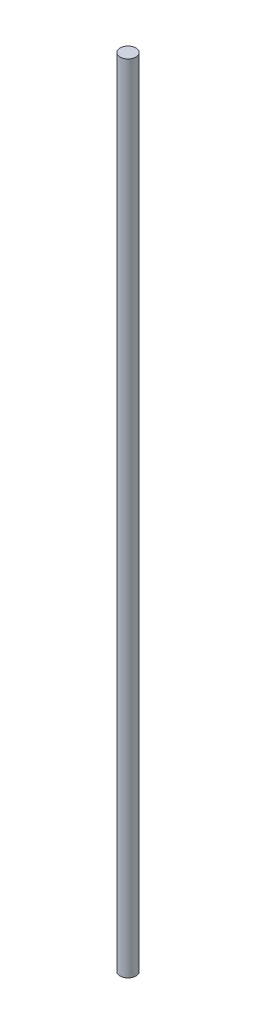
ISO-10303-21;
HEADER;
FILE_DESCRIPTION(('STEP AP214'),'2;1');
FILE_NAME('part.step','',(''),(''),'','','');
FILE_SCHEMA(('AUTOMOTIVE_DESIGN { 1 0 10303 214 1 1 1 1 }'));
ENDSEC;
DATA;
#1=APPLICATION_CONTEXT('core data for automotive mechanical design processes');
#2=APPLICATION_PROTOCOL_DEFINITION('international standard','automotive_design',2000,#1);
#3=PRODUCT_CONTEXT('',#1,'mechanical');
#4=PRODUCT('Part','Part','',(#3));
#5=PRODUCT_RELATED_PRODUCT_CATEGORY('part','',(#4));
#6=PRODUCT_DEFINITION_FORMATION('','',#4);
#7=PRODUCT_DEFINITION_CONTEXT('part definition',#1,'design');
#8=PRODUCT_DEFINITION('design','',#6,#7);
#9=PRODUCT_DEFINITION_SHAPE('','',#8);
#10=(LENGTH_UNIT() NAMED_UNIT(*) SI_UNIT(.MILLI.,.METRE.));
#11=(NAMED_UNIT(*) PLANE_ANGLE_UNIT() SI_UNIT($,.RADIAN.));
#12=(NAMED_UNIT(*) SI_UNIT($,.STERADIAN.) SOLID_ANGLE_UNIT());
#13=UNCERTAINTY_MEASURE_WITH_UNIT(LENGTH_MEASURE(1.E-05),#10,'distance_accuracy_value','');
#14=(GEOMETRIC_REPRESENTATION_CONTEXT(3) GLOBAL_UNCERTAINTY_ASSIGNED_CONTEXT((#13)) GLOBAL_UNIT_ASSIGNED_CONTEXT((#10,
#11,#12)) REPRESENTATION_CONTEXT('',''));
#15=CARTESIAN_POINT('',(0.,0.,0.));
#16=DIRECTION('',(0.,0.,1.));
#17=DIRECTION('',(1.,0.,0.));
#18=AXIS2_PLACEMENT_3D('',#15,#16,#17);
#19=CARTESIAN_POINT('',(0.,150.,0.));
#20=DIRECTION('',(0.,-1.,0.));
#21=DIRECTION('',(0.,0.,-1.));
#22=AXIS2_PLACEMENT_3D('',#19,#20,#21);
#23=CYLINDRICAL_SURFACE('',#22,1.5);
#24=CARTESIAN_POINT('',(0.,150.,0.));
#25=DIRECTION('',(0.,1.,0.));
#26=DIRECTION('',(0.,0.,1.));
#27=AXIS2_PLACEMENT_3D('',#24,#25,#26);
#28=CIRCLE('',#27,1.5);
#29=CARTESIAN_POINT('',(0.,150.,1.5));
#30=VERTEX_POINT('',#29);
#31=EDGE_CURVE('E10',#30,#30,#28,.T.);
#32=ORIENTED_EDGE('',*,*,#31,.F.);
#33=EDGE_LOOP('',(#32));
#34=FACE_BOUND('',#33,.T.);
#35=CARTESIAN_POINT('',(0.,0.,0.));
#36=DIRECTION('',(0.,1.,0.));
#37=DIRECTION('',(0.,0.,1.));
#38=AXIS2_PLACEMENT_3D('',#35,#36,#37);
#39=CIRCLE('',#38,1.5);
#40=CARTESIAN_POINT('',(0.,0.,1.5));
#41=VERTEX_POINT('',#40);
#42=EDGE_CURVE('E43',#41,#41,#39,.T.);
#43=ORIENTED_EDGE('',*,*,#42,.T.);
#44=EDGE_LOOP('',(#43));
#45=FACE_BOUND('',#44,.T.);
#46=ADVANCED_FACE('F40',(#34,#45),#23,.T.);
#47=CARTESIAN_POINT('',(0.,150.,0.));
#48=DIRECTION('',(0.,1.,0.));
#49=DIRECTION('',(0.,0.,1.));
#50=AXIS2_PLACEMENT_3D('',#47,#48,#49);
#51=PLANE('',#50);
#52=ORIENTED_EDGE('',*,*,#31,.T.);
#53=EDGE_LOOP('',(#52));
#54=FACE_BOUND('',#53,.T.);
#55=ADVANCED_FACE('F55',(#54),#51,.T.);
#56=CARTESIAN_POINT('',(0.,0.,0.));
#57=DIRECTION('',(0.,1.,0.));
#58=DIRECTION('',(0.,0.,1.));
#59=AXIS2_PLACEMENT_3D('',#56,#57,#58);
#60=PLANE('',#59);
#61=ORIENTED_EDGE('',*,*,#42,.F.);
#62=EDGE_LOOP('',(#61));
#63=FACE_BOUND('',#62,.T.);
#64=ADVANCED_FACE('F53',(#63),#60,.F.);
#65=CLOSED_SHELL('',(#46,#55,#64));
#66=MANIFOLD_SOLID_BREP('B2',#65);
#67=ADVANCED_BREP_SHAPE_REPRESENTATION('',(#18,#66),#14);
#68=SHAPE_DEFINITION_REPRESENTATION(#9,#67);
ENDSEC;
END-ISO-10303-21;
